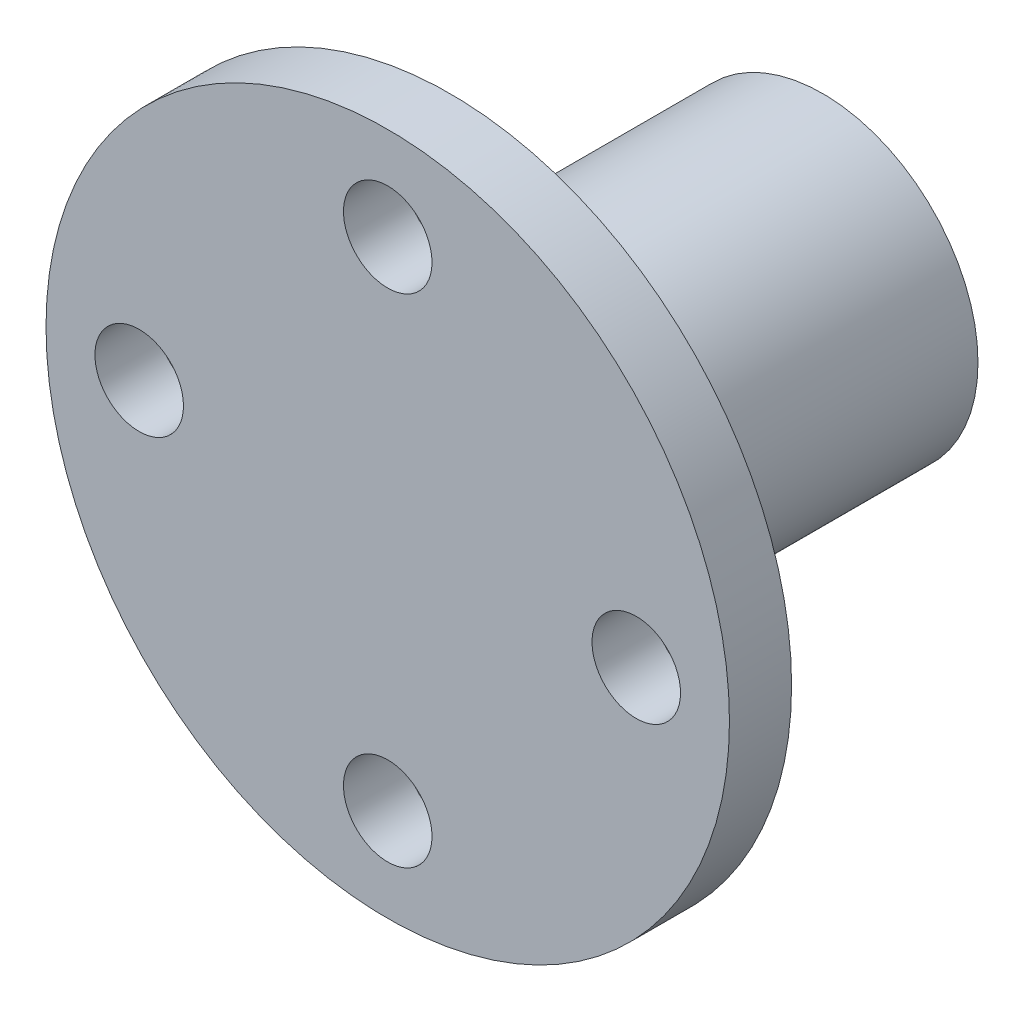
ISO-10303-21;
HEADER;
FILE_DESCRIPTION(('STEP AP214'),'2;1');
FILE_NAME('part.step','',(''),(''),'','','');
FILE_SCHEMA(('AUTOMOTIVE_DESIGN { 1 0 10303 214 1 1 1 1 }'));
ENDSEC;
DATA;
#1=APPLICATION_CONTEXT('core data for automotive mechanical design processes');
#2=APPLICATION_PROTOCOL_DEFINITION('international standard','automotive_design',2000,#1);
#3=PRODUCT_CONTEXT('',#1,'mechanical');
#4=PRODUCT('Part','Part','',(#3));
#5=PRODUCT_RELATED_PRODUCT_CATEGORY('part','',(#4));
#6=PRODUCT_DEFINITION_FORMATION('','',#4);
#7=PRODUCT_DEFINITION_CONTEXT('part definition',#1,'design');
#8=PRODUCT_DEFINITION('design','',#6,#7);
#9=PRODUCT_DEFINITION_SHAPE('','',#8);
#10=(LENGTH_UNIT() NAMED_UNIT(*) SI_UNIT(.MILLI.,.METRE.));
#11=(NAMED_UNIT(*) PLANE_ANGLE_UNIT() SI_UNIT($,.RADIAN.));
#12=(NAMED_UNIT(*) SI_UNIT($,.STERADIAN.) SOLID_ANGLE_UNIT());
#13=UNCERTAINTY_MEASURE_WITH_UNIT(LENGTH_MEASURE(1.E-05),#10,'distance_accuracy_value','');
#14=(GEOMETRIC_REPRESENTATION_CONTEXT(3) GLOBAL_UNCERTAINTY_ASSIGNED_CONTEXT((#13)) GLOBAL_UNIT_ASSIGNED_CONTEXT((#10,
#11,#12)) REPRESENTATION_CONTEXT('',''));
#15=CARTESIAN_POINT('',(0.,0.,0.));
#16=DIRECTION('',(0.,0.,1.));
#17=DIRECTION('',(1.,0.,0.));
#18=AXIS2_PLACEMENT_3D('',#15,#16,#17);
#19=CARTESIAN_POINT('',(0.,0.,2.));
#20=DIRECTION('',(0.,0.,-1.));
#21=DIRECTION('',(-1.,0.,0.));
#22=AXIS2_PLACEMENT_3D('',#19,#20,#21);
#23=CYLINDRICAL_SURFACE('',#22,11.);
#24=CARTESIAN_POINT('',(0.,0.,2.));
#25=DIRECTION('',(0.,0.,1.));
#26=DIRECTION('',(1.,0.,0.));
#27=AXIS2_PLACEMENT_3D('',#24,#25,#26);
#28=CIRCLE('',#27,11.);
#29=CARTESIAN_POINT('',(11.,0.,2.));
#30=VERTEX_POINT('',#29);
#31=EDGE_CURVE('E59',#30,#30,#28,.T.);
#32=ORIENTED_EDGE('',*,*,#31,.F.);
#33=EDGE_LOOP('',(#32));
#34=FACE_BOUND('',#33,.T.);
#35=CARTESIAN_POINT('',(0.,0.,0.));
#36=DIRECTION('',(0.,0.,1.));
#37=DIRECTION('',(1.,0.,0.));
#38=AXIS2_PLACEMENT_3D('',#35,#36,#37);
#39=CIRCLE('',#38,11.);
#40=CARTESIAN_POINT('',(11.,0.,0.));
#41=VERTEX_POINT('',#40);
#42=EDGE_CURVE('E90',#41,#41,#39,.T.);
#43=ORIENTED_EDGE('',*,*,#42,.T.);
#44=EDGE_LOOP('',(#43));
#45=FACE_BOUND('',#44,.T.);
#46=ADVANCED_FACE('F51',(#34,#45),#23,.T.);
#47=CARTESIAN_POINT('',(8.,0.,2.));
#48=DIRECTION('',(0.,0.,-1.));
#49=DIRECTION('',(-1.,0.,0.));
#50=AXIS2_PLACEMENT_3D('',#47,#48,#49);
#51=CYLINDRICAL_SURFACE('',#50,1.425);
#52=CARTESIAN_POINT('',(8.,0.,2.));
#53=DIRECTION('',(0.,0.,1.));
#54=DIRECTION('',(1.,0.,0.));
#55=AXIS2_PLACEMENT_3D('',#52,#53,#54);
#56=CIRCLE('',#55,1.425);
#57=CARTESIAN_POINT('',(9.425,0.,2.));
#58=VERTEX_POINT('',#57);
#59=EDGE_CURVE('E64',#58,#58,#56,.T.);
#60=ORIENTED_EDGE('',*,*,#59,.T.);
#61=EDGE_LOOP('',(#60));
#62=FACE_BOUND('',#61,.T.);
#63=CARTESIAN_POINT('',(8.,0.,0.));
#64=DIRECTION('',(0.,0.,1.));
#65=DIRECTION('',(1.,0.,0.));
#66=AXIS2_PLACEMENT_3D('',#63,#64,#65);
#67=CIRCLE('',#66,1.425);
#68=CARTESIAN_POINT('',(9.425,0.,0.));
#69=VERTEX_POINT('',#68);
#70=EDGE_CURVE('E87',#69,#69,#67,.T.);
#71=ORIENTED_EDGE('',*,*,#70,.F.);
#72=EDGE_LOOP('',(#71));
#73=FACE_BOUND('',#72,.T.);
#74=ADVANCED_FACE('F124',(#62,#73),#51,.F.);
#75=CARTESIAN_POINT('',(0.,-8.,2.));
#76=DIRECTION('',(0.,0.,-1.));
#77=DIRECTION('',(-1.,0.,0.));
#78=AXIS2_PLACEMENT_3D('',#75,#76,#77);
#79=CYLINDRICAL_SURFACE('',#78,1.425);
#80=CARTESIAN_POINT('',(0.,-8.,2.));
#81=DIRECTION('',(0.,0.,1.));
#82=DIRECTION('',(1.,0.,0.));
#83=AXIS2_PLACEMENT_3D('',#80,#81,#82);
#84=CIRCLE('',#83,1.425);
#85=CARTESIAN_POINT('',(1.42499999999994,-8.,2.));
#86=VERTEX_POINT('',#85);
#87=EDGE_CURVE('E70',#86,#86,#84,.T.);
#88=ORIENTED_EDGE('',*,*,#87,.T.);
#89=EDGE_LOOP('',(#88));
#90=FACE_BOUND('',#89,.T.);
#91=CARTESIAN_POINT('',(0.,-8.,0.));
#92=DIRECTION('',(0.,0.,1.));
#93=DIRECTION('',(1.,0.,0.));
#94=AXIS2_PLACEMENT_3D('',#91,#92,#93);
#95=CIRCLE('',#94,1.425);
#96=CARTESIAN_POINT('',(1.42499999999994,-8.,0.));
#97=VERTEX_POINT('',#96);
#98=EDGE_CURVE('E83',#97,#97,#95,.T.);
#99=ORIENTED_EDGE('',*,*,#98,.F.);
#100=EDGE_LOOP('',(#99));
#101=FACE_BOUND('',#100,.T.);
#102=ADVANCED_FACE('F112',(#90,#101),#79,.F.);
#103=CARTESIAN_POINT('',(-8.,0.,2.));
#104=DIRECTION('',(0.,0.,-1.));
#105=DIRECTION('',(-1.,0.,0.));
#106=AXIS2_PLACEMENT_3D('',#103,#104,#105);
#107=CYLINDRICAL_SURFACE('',#106,1.425);
#108=CARTESIAN_POINT('',(-8.,0.,2.));
#109=DIRECTION('',(0.,0.,1.));
#110=DIRECTION('',(1.,0.,0.));
#111=AXIS2_PLACEMENT_3D('',#108,#109,#110);
#112=CIRCLE('',#111,1.425);
#113=CARTESIAN_POINT('',(-6.575,0.,2.));
#114=VERTEX_POINT('',#113);
#115=EDGE_CURVE('E98',#114,#114,#112,.T.);
#116=ORIENTED_EDGE('',*,*,#115,.T.);
#117=EDGE_LOOP('',(#116));
#118=FACE_BOUND('',#117,.T.);
#119=CARTESIAN_POINT('',(-8.,0.,0.));
#120=DIRECTION('',(0.,0.,1.));
#121=DIRECTION('',(1.,0.,0.));
#122=AXIS2_PLACEMENT_3D('',#119,#120,#121);
#123=CIRCLE('',#122,1.425);
#124=CARTESIAN_POINT('',(-6.575,0.,0.));
#125=VERTEX_POINT('',#124);
#126=EDGE_CURVE('E78',#125,#125,#123,.T.);
#127=ORIENTED_EDGE('',*,*,#126,.F.);
#128=EDGE_LOOP('',(#127));
#129=FACE_BOUND('',#128,.T.);
#130=ADVANCED_FACE('F139',(#118,#129),#107,.F.);
#131=CARTESIAN_POINT('',(0.,8.,2.));
#132=DIRECTION('',(0.,0.,-1.));
#133=DIRECTION('',(-1.,0.,0.));
#134=AXIS2_PLACEMENT_3D('',#131,#132,#133);
#135=CYLINDRICAL_SURFACE('',#134,1.425);
#136=CARTESIAN_POINT('',(0.,8.,2.));
#137=DIRECTION('',(0.,0.,1.));
#138=DIRECTION('',(1.,0.,0.));
#139=AXIS2_PLACEMENT_3D('',#136,#137,#138);
#140=CIRCLE('',#139,1.425);
#141=CARTESIAN_POINT('',(1.425,8.,2.));
#142=VERTEX_POINT('',#141);
#143=EDGE_CURVE('E93',#142,#142,#140,.T.);
#144=ORIENTED_EDGE('',*,*,#143,.T.);
#145=EDGE_LOOP('',(#144));
#146=FACE_BOUND('',#145,.T.);
#147=CARTESIAN_POINT('',(0.,8.,0.));
#148=DIRECTION('',(0.,0.,1.));
#149=DIRECTION('',(1.,0.,0.));
#150=AXIS2_PLACEMENT_3D('',#147,#148,#149);
#151=CIRCLE('',#150,1.425);
#152=CARTESIAN_POINT('',(1.425,8.,0.));
#153=VERTEX_POINT('',#152);
#154=EDGE_CURVE('E74',#153,#153,#151,.T.);
#155=ORIENTED_EDGE('',*,*,#154,.F.);
#156=EDGE_LOOP('',(#155));
#157=FACE_BOUND('',#156,.T.);
#158=ADVANCED_FACE('F53',(#146,#157),#135,.F.);
#159=CARTESIAN_POINT('',(0.,0.,0.));
#160=DIRECTION('',(0.,0.,1.));
#161=DIRECTION('',(1.,0.,0.));
#162=AXIS2_PLACEMENT_3D('',#159,#160,#161);
#163=PLANE('',#162);
#164=CARTESIAN_POINT('',(0.,0.,0.));
#165=DIRECTION('',(0.,0.,1.));
#166=DIRECTION('',(1.,0.,0.));
#167=AXIS2_PLACEMENT_3D('',#164,#165,#166);
#168=CIRCLE('',#167,5.);
#169=CARTESIAN_POINT('',(5.,0.,0.));
#170=VERTEX_POINT('',#169);
#171=EDGE_CURVE('E106',#170,#170,#168,.T.);
#172=ORIENTED_EDGE('',*,*,#171,.T.);
#173=EDGE_LOOP('',(#172));
#174=FACE_BOUND('',#173,.T.);
#175=ORIENTED_EDGE('',*,*,#154,.T.);
#176=EDGE_LOOP('',(#175));
#177=FACE_BOUND('',#176,.T.);
#178=ORIENTED_EDGE('',*,*,#126,.T.);
#179=EDGE_LOOP('',(#178));
#180=FACE_BOUND('',#179,.T.);
#181=ORIENTED_EDGE('',*,*,#98,.T.);
#182=EDGE_LOOP('',(#181));
#183=FACE_BOUND('',#182,.T.);
#184=ORIENTED_EDGE('',*,*,#70,.T.);
#185=EDGE_LOOP('',(#184));
#186=FACE_BOUND('',#185,.T.);
#187=ORIENTED_EDGE('',*,*,#42,.F.);
#188=EDGE_LOOP('',(#187));
#189=FACE_BOUND('',#188,.T.);
#190=ADVANCED_FACE('F119',(#174,#177,#180,#183,#186,#189),#163,.F.);
#191=CARTESIAN_POINT('',(0.,0.,2.));
#192=DIRECTION('',(0.,0.,1.));
#193=DIRECTION('',(1.,0.,0.));
#194=AXIS2_PLACEMENT_3D('',#191,#192,#193);
#195=PLANE('',#194);
#196=ORIENTED_EDGE('',*,*,#143,.F.);
#197=EDGE_LOOP('',(#196));
#198=FACE_BOUND('',#197,.T.);
#199=ORIENTED_EDGE('',*,*,#115,.F.);
#200=EDGE_LOOP('',(#199));
#201=FACE_BOUND('',#200,.T.);
#202=ORIENTED_EDGE('',*,*,#87,.F.);
#203=EDGE_LOOP('',(#202));
#204=FACE_BOUND('',#203,.T.);
#205=ORIENTED_EDGE('',*,*,#59,.F.);
#206=EDGE_LOOP('',(#205));
#207=FACE_BOUND('',#206,.T.);
#208=ORIENTED_EDGE('',*,*,#31,.T.);
#209=EDGE_LOOP('',(#208));
#210=FACE_BOUND('',#209,.T.);
#211=ADVANCED_FACE('F115',(#198,#201,#204,#207,#210),#195,.T.);
#212=CARTESIAN_POINT('',(0.,0.,-12.));
#213=DIRECTION('',(0.,0.,1.));
#214=DIRECTION('',(1.,0.,0.));
#215=AXIS2_PLACEMENT_3D('',#212,#213,#214);
#216=CYLINDRICAL_SURFACE('',#215,3.);
#217=CARTESIAN_POINT('',(0.,0.,-12.));
#218=DIRECTION('',(0.,0.,1.));
#219=DIRECTION('',(1.,0.,0.));
#220=AXIS2_PLACEMENT_3D('',#217,#218,#219);
#221=CIRCLE('',#220,3.);
#222=CARTESIAN_POINT('',(3.,0.,-12.));
#223=VERTEX_POINT('',#222);
#224=EDGE_CURVE('E218',#223,#223,#221,.T.);
#225=ORIENTED_EDGE('',*,*,#224,.F.);
#226=EDGE_LOOP('',(#225));
#227=FACE_BOUND('',#226,.T.);
#228=CARTESIAN_POINT('',(0.,0.,0.));
#229=DIRECTION('',(0.,0.,1.));
#230=DIRECTION('',(1.,0.,0.));
#231=AXIS2_PLACEMENT_3D('',#228,#229,#230);
#232=CIRCLE('',#231,3.);
#233=CARTESIAN_POINT('',(3.,0.,0.));
#234=VERTEX_POINT('',#233);
#235=EDGE_CURVE('E11',#234,#234,#232,.T.);
#236=ORIENTED_EDGE('',*,*,#235,.T.);
#237=EDGE_LOOP('',(#236));
#238=FACE_BOUND('',#237,.T.);
#239=ADVANCED_FACE('F118',(#227,#238),#216,.F.);
#240=CARTESIAN_POINT('',(0.,0.,-12.));
#241=DIRECTION('',(0.,0.,1.));
#242=DIRECTION('',(1.,0.,0.));
#243=AXIS2_PLACEMENT_3D('',#240,#241,#242);
#244=CYLINDRICAL_SURFACE('',#243,5.);
#245=CARTESIAN_POINT('',(0.,0.,-12.));
#246=DIRECTION('',(0.,0.,1.));
#247=DIRECTION('',(1.,0.,0.));
#248=AXIS2_PLACEMENT_3D('',#245,#246,#247);
#249=CIRCLE('',#248,5.);
#250=CARTESIAN_POINT('',(5.,0.,-12.));
#251=VERTEX_POINT('',#250);
#252=EDGE_CURVE('E79',#251,#251,#249,.T.);
#253=ORIENTED_EDGE('',*,*,#252,.T.);
#254=EDGE_LOOP('',(#253));
#255=FACE_BOUND('',#254,.T.);
#256=ORIENTED_EDGE('',*,*,#171,.F.);
#257=EDGE_LOOP('',(#256));
#258=FACE_BOUND('',#257,.T.);
#259=ADVANCED_FACE('F194',(#255,#258),#244,.T.);
#260=CARTESIAN_POINT('',(0.,0.,-12.));
#261=DIRECTION('',(0.,0.,1.));
#262=DIRECTION('',(1.,0.,0.));
#263=AXIS2_PLACEMENT_3D('',#260,#261,#262);
#264=PLANE('',#263);
#265=ORIENTED_EDGE('',*,*,#224,.T.);
#266=EDGE_LOOP('',(#265));
#267=FACE_BOUND('',#266,.T.);
#268=ORIENTED_EDGE('',*,*,#252,.F.);
#269=EDGE_LOOP('',(#268));
#270=FACE_BOUND('',#269,.T.);
#271=ADVANCED_FACE('F144',(#267,#270),#264,.F.);
#272=ORIENTED_EDGE('',*,*,#235,.F.);
#273=EDGE_LOOP('',(#272));
#274=FACE_BOUND('',#273,.T.);
#275=ADVANCED_FACE('F134',(#274),#163,.F.);
#276=CLOSED_SHELL('',(#46,#74,#102,#130,#158,#190,#211,#239,#259,#271,#275));
#277=MANIFOLD_SOLID_BREP('B2',#276);
#278=ADVANCED_BREP_SHAPE_REPRESENTATION('',(#18,#277),#14);
#279=SHAPE_DEFINITION_REPRESENTATION(#9,#278);
ENDSEC;
END-ISO-10303-21;
